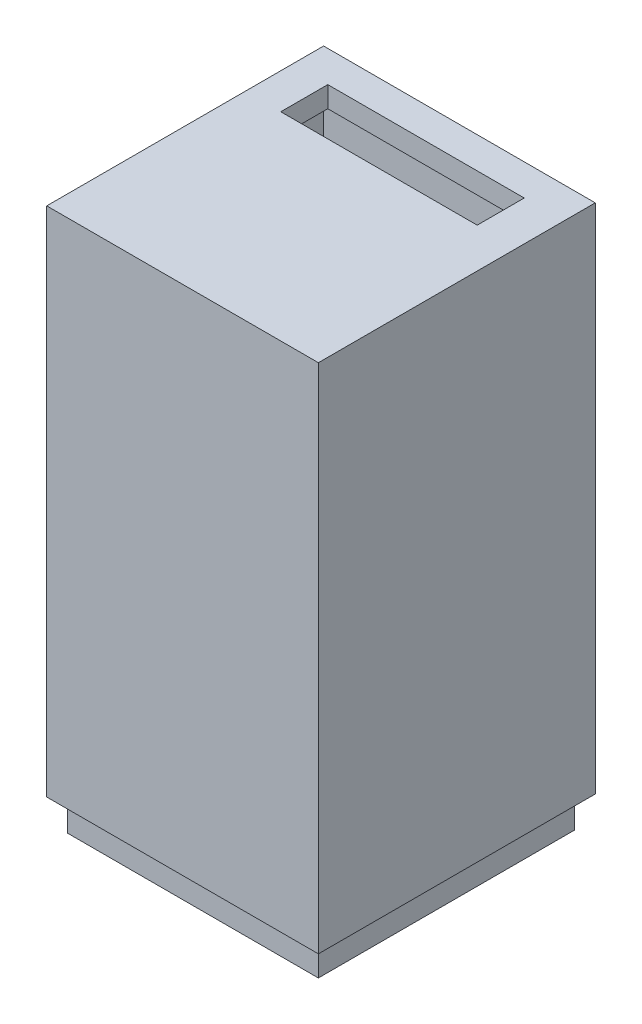
ISO-10303-21;
HEADER;
FILE_DESCRIPTION(('STEP AP214'),'2;1');
FILE_NAME('part.step','',(''),(''),'','','');
FILE_SCHEMA(('AUTOMOTIVE_DESIGN { 1 0 10303 214 1 1 1 1 }'));
ENDSEC;
DATA;
#1=APPLICATION_CONTEXT('core data for automotive mechanical design processes');
#2=APPLICATION_PROTOCOL_DEFINITION('international standard','automotive_design',2000,#1);
#3=PRODUCT_CONTEXT('',#1,'mechanical');
#4=PRODUCT('Part','Part','',(#3));
#5=PRODUCT_RELATED_PRODUCT_CATEGORY('part','',(#4));
#6=PRODUCT_DEFINITION_FORMATION('','',#4);
#7=PRODUCT_DEFINITION_CONTEXT('part definition',#1,'design');
#8=PRODUCT_DEFINITION('design','',#6,#7);
#9=PRODUCT_DEFINITION_SHAPE('','',#8);
#10=(LENGTH_UNIT() NAMED_UNIT(*) SI_UNIT(.MILLI.,.METRE.));
#11=(NAMED_UNIT(*) PLANE_ANGLE_UNIT() SI_UNIT($,.RADIAN.));
#12=(NAMED_UNIT(*) SI_UNIT($,.STERADIAN.) SOLID_ANGLE_UNIT());
#13=UNCERTAINTY_MEASURE_WITH_UNIT(LENGTH_MEASURE(1.E-05),#10,'distance_accuracy_value','');
#14=(GEOMETRIC_REPRESENTATION_CONTEXT(3) GLOBAL_UNCERTAINTY_ASSIGNED_CONTEXT((#13)) GLOBAL_UNIT_ASSIGNED_CONTEXT((#10,
#11,#12)) REPRESENTATION_CONTEXT('',''));
#15=CARTESIAN_POINT('',(0.,0.,0.));
#16=DIRECTION('',(0.,0.,1.));
#17=DIRECTION('',(1.,0.,0.));
#18=AXIS2_PLACEMENT_3D('',#15,#16,#17);
#19=CARTESIAN_POINT('',(0.,0.,0.));
#20=DIRECTION('',(0.,-1.,0.));
#21=DIRECTION('',(0.,0.,-1.));
#22=AXIS2_PLACEMENT_3D('',#19,#20,#21);
#23=PLANE('',#22);
#24=DIRECTION('',(0.,0.,-1.));
#25=VECTOR('',#24,1.);
#26=CARTESIAN_POINT('',(-2.,0.,19.));
#27=LINE('',#26,#25);
#28=CARTESIAN_POINT('',(-2.,0.,19.));
#29=VERTEX_POINT('',#28);
#30=CARTESIAN_POINT('',(-2.,0.,-7.5));
#31=VERTEX_POINT('',#30);
#32=EDGE_CURVE('E203',#29,#31,#27,.T.);
#33=ORIENTED_EDGE('',*,*,#32,.T.);
#34=DIRECTION('',(1.,0.,0.));
#35=VECTOR('',#34,1.);
#36=CARTESIAN_POINT('',(-2.,0.,-7.5));
#37=LINE('',#36,#35);
#38=CARTESIAN_POINT('',(24.,0.,-7.5));
#39=VERTEX_POINT('',#38);
#40=EDGE_CURVE('E205',#31,#39,#37,.T.);
#41=ORIENTED_EDGE('',*,*,#40,.T.);
#42=DIRECTION('',(0.,0.,1.));
#43=VECTOR('',#42,1.);
#44=CARTESIAN_POINT('',(24.,0.,19.));
#45=LINE('',#44,#43);
#46=CARTESIAN_POINT('',(24.,0.,19.));
#47=VERTEX_POINT('',#46);
#48=EDGE_CURVE('E56',#39,#47,#45,.T.);
#49=ORIENTED_EDGE('',*,*,#48,.T.);
#50=DIRECTION('',(-1.,0.,0.));
#51=VECTOR('',#50,1.);
#52=CARTESIAN_POINT('',(-2.,0.,19.));
#53=LINE('',#52,#51);
#54=EDGE_CURVE('E208',#47,#29,#53,.T.);
#55=ORIENTED_EDGE('',*,*,#54,.T.);
#56=EDGE_LOOP('',(#33,#41,#49,#55));
#57=FACE_BOUND('',#56,.T.);
#58=DIRECTION('',(1.,0.,0.));
#59=VECTOR('',#58,1.);
#60=CARTESIAN_POINT('',(-0.999999999999997,0.,-6.49906928932583));
#61=LINE('',#60,#59);
#62=CARTESIAN_POINT('',(-0.999999999999997,0.,-6.49906928932583));
#63=VERTEX_POINT('',#62);
#64=CARTESIAN_POINT('',(23.,0.,-6.49906928932583));
#65=VERTEX_POINT('',#64);
#66=EDGE_CURVE('E190',#63,#65,#61,.T.);
#67=ORIENTED_EDGE('',*,*,#66,.F.);
#68=DIRECTION('',(0.,0.,-1.));
#69=VECTOR('',#68,1.);
#70=CARTESIAN_POINT('',(-1.,0.,18.0009307106742));
#71=LINE('',#70,#69);
#72=CARTESIAN_POINT('',(-1.,0.,18.0009307106742));
#73=VERTEX_POINT('',#72);
#74=EDGE_CURVE('E176',#73,#63,#71,.T.);
#75=ORIENTED_EDGE('',*,*,#74,.F.);
#76=DIRECTION('',(-1.,0.,0.));
#77=VECTOR('',#76,1.);
#78=CARTESIAN_POINT('',(-1.,0.,18.0009307106742));
#79=LINE('',#78,#77);
#80=CARTESIAN_POINT('',(23.,0.,18.0009307106742));
#81=VERTEX_POINT('',#80);
#82=EDGE_CURVE('E181',#81,#73,#79,.T.);
#83=ORIENTED_EDGE('',*,*,#82,.F.);
#84=DIRECTION('',(0.,0.,1.));
#85=VECTOR('',#84,1.);
#86=CARTESIAN_POINT('',(23.,0.,18.0009307106742));
#87=LINE('',#86,#85);
#88=EDGE_CURVE('E192',#65,#81,#87,.T.);
#89=ORIENTED_EDGE('',*,*,#88,.F.);
#90=EDGE_LOOP('',(#67,#75,#83,#89));
#91=FACE_BOUND('',#90,.T.);
#92=ADVANCED_FACE('F33',(#57,#91),#23,.T.);
#93=CARTESIAN_POINT('',(-2.,49.,-5.5));
#94=DIRECTION('',(-1.,0.,0.));
#95=DIRECTION('',(0.,-1.,0.));
#96=AXIS2_PLACEMENT_3D('',#93,#94,#95);
#97=PLANE('',#96);
#98=DIRECTION('',(0.,1.,0.));
#99=VECTOR('',#98,1.);
#100=CARTESIAN_POINT('',(-1.99999999999999,49.,-7.5));
#101=LINE('',#100,#99);
#102=CARTESIAN_POINT('',(-1.99999999999999,49.,-7.5));
#103=VERTEX_POINT('',#102);
#104=EDGE_CURVE('E255',#31,#103,#101,.T.);
#105=ORIENTED_EDGE('',*,*,#104,.F.);
#106=ORIENTED_EDGE('',*,*,#32,.F.);
#107=DIRECTION('',(0.,-1.,0.));
#108=VECTOR('',#107,1.);
#109=CARTESIAN_POINT('',(-2.,49.,19.));
#110=LINE('',#109,#108);
#111=CARTESIAN_POINT('',(-2.,49.,19.));
#112=VERTEX_POINT('',#111);
#113=EDGE_CURVE('E210',#112,#29,#110,.T.);
#114=ORIENTED_EDGE('',*,*,#113,.F.);
#115=DIRECTION('',(0.,0.,1.));
#116=VECTOR('',#115,1.);
#117=CARTESIAN_POINT('',(-2.,49.,-5.5));
#118=LINE('',#117,#116);
#119=EDGE_CURVE('E11',#103,#112,#118,.T.);
#120=ORIENTED_EDGE('',*,*,#119,.F.);
#121=EDGE_LOOP('',(#105,#106,#114,#120));
#122=FACE_BOUND('',#121,.T.);
#123=ADVANCED_FACE('F35',(#122),#97,.T.);
#124=CARTESIAN_POINT('',(24.,49.,-5.5));
#125=DIRECTION('',(1.,0.,0.));
#126=DIRECTION('',(0.,1.,0.));
#127=AXIS2_PLACEMENT_3D('',#124,#125,#126);
#128=PLANE('',#127);
#129=DIRECTION('',(0.,1.,0.));
#130=VECTOR('',#129,1.);
#131=CARTESIAN_POINT('',(24.,49.,19.));
#132=LINE('',#131,#130);
#133=CARTESIAN_POINT('',(24.,49.,19.));
#134=VERTEX_POINT('',#133);
#135=EDGE_CURVE('E213',#47,#134,#132,.T.);
#136=ORIENTED_EDGE('',*,*,#135,.F.);
#137=ORIENTED_EDGE('',*,*,#48,.F.);
#138=DIRECTION('',(0.,-1.,0.));
#139=VECTOR('',#138,1.);
#140=CARTESIAN_POINT('',(24.,49.,-7.5));
#141=LINE('',#140,#139);
#142=CARTESIAN_POINT('',(24.,49.,-7.5));
#143=VERTEX_POINT('',#142);
#144=EDGE_CURVE('E252',#143,#39,#141,.T.);
#145=ORIENTED_EDGE('',*,*,#144,.F.);
#146=DIRECTION('',(0.,0.,1.));
#147=VECTOR('',#146,1.);
#148=CARTESIAN_POINT('',(24.,49.,-5.5));
#149=LINE('',#148,#147);
#150=EDGE_CURVE('E37',#143,#134,#149,.T.);
#151=ORIENTED_EDGE('',*,*,#150,.T.);
#152=EDGE_LOOP('',(#136,#137,#145,#151));
#153=FACE_BOUND('',#152,.T.);
#154=ADVANCED_FACE('F299',(#153),#128,.T.);
#155=CARTESIAN_POINT('',(0.,0.,-7.5));
#156=DIRECTION('',(0.,0.,-1.));
#157=DIRECTION('',(-1.,0.,0.));
#158=AXIS2_PLACEMENT_3D('',#155,#156,#157);
#159=PLANE('',#158);
#160=ORIENTED_EDGE('',*,*,#144,.T.);
#161=ORIENTED_EDGE('',*,*,#40,.F.);
#162=ORIENTED_EDGE('',*,*,#104,.T.);
#163=DIRECTION('',(1.,0.,0.));
#164=VECTOR('',#163,1.);
#165=CARTESIAN_POINT('',(24.,49.,-7.5));
#166=LINE('',#165,#164);
#167=EDGE_CURVE('E257',#103,#143,#166,.T.);
#168=ORIENTED_EDGE('',*,*,#167,.T.);
#169=EDGE_LOOP('',(#160,#161,#162,#168));
#170=FACE_BOUND('',#169,.T.);
#171=ADVANCED_FACE('F307',(#170),#159,.T.);
#172=CARTESIAN_POINT('',(0.,0.,19.));
#173=DIRECTION('',(0.,0.,1.));
#174=DIRECTION('',(1.,0.,0.));
#175=AXIS2_PLACEMENT_3D('',#172,#173,#174);
#176=PLANE('',#175);
#177=ORIENTED_EDGE('',*,*,#113,.T.);
#178=ORIENTED_EDGE('',*,*,#54,.F.);
#179=ORIENTED_EDGE('',*,*,#135,.T.);
#180=DIRECTION('',(-1.,0.,0.));
#181=VECTOR('',#180,1.);
#182=CARTESIAN_POINT('',(-2.,49.,19.));
#183=LINE('',#182,#181);
#184=EDGE_CURVE('E215',#134,#112,#183,.T.);
#185=ORIENTED_EDGE('',*,*,#184,.T.);
#186=EDGE_LOOP('',(#177,#178,#179,#185));
#187=FACE_BOUND('',#186,.T.);
#188=ADVANCED_FACE('F304',(#187),#176,.T.);
#189=CARTESIAN_POINT('',(-2.,49.,-5.5));
#190=DIRECTION('',(0.,1.,0.));
#191=DIRECTION('',(0.,0.,1.));
#192=AXIS2_PLACEMENT_3D('',#189,#190,#191);
#193=PLANE('',#192);
#194=DIRECTION('',(1.,0.,0.));
#195=VECTOR('',#194,1.);
#196=CARTESIAN_POINT('',(1.4,49.,-4.5));
#197=LINE('',#196,#195);
#198=CARTESIAN_POINT('',(1.4,49.,-4.5));
#199=VERTEX_POINT('',#198);
#200=CARTESIAN_POINT('',(20.2,49.,-4.5));
#201=VERTEX_POINT('',#200);
#202=EDGE_CURVE('E222',#199,#201,#197,.T.);
#203=ORIENTED_EDGE('',*,*,#202,.T.);
#204=DIRECTION('',(0.,0.,1.));
#205=VECTOR('',#204,1.);
#206=CARTESIAN_POINT('',(20.2,49.,-4.5));
#207=LINE('',#206,#205);
#208=CARTESIAN_POINT('',(20.2,49.,0.));
#209=VERTEX_POINT('',#208);
#210=EDGE_CURVE('E246',#201,#209,#207,.T.);
#211=ORIENTED_EDGE('',*,*,#210,.T.);
#212=DIRECTION('',(1.,0.,0.));
#213=VECTOR('',#212,1.);
#214=CARTESIAN_POINT('',(1.4,49.,0.));
#215=LINE('',#214,#213);
#216=CARTESIAN_POINT('',(1.4,49.,0.));
#217=VERTEX_POINT('',#216);
#218=EDGE_CURVE('E234',#217,#209,#215,.T.);
#219=ORIENTED_EDGE('',*,*,#218,.F.);
#220=DIRECTION('',(0.,0.,1.));
#221=VECTOR('',#220,1.);
#222=CARTESIAN_POINT('',(1.4,49.,-4.5));
#223=LINE('',#222,#221);
#224=EDGE_CURVE('E249',#199,#217,#223,.T.);
#225=ORIENTED_EDGE('',*,*,#224,.F.);
#226=EDGE_LOOP('',(#203,#211,#219,#225));
#227=FACE_BOUND('',#226,.T.);
#228=ORIENTED_EDGE('',*,*,#119,.T.);
#229=ORIENTED_EDGE('',*,*,#184,.F.);
#230=ORIENTED_EDGE('',*,*,#150,.F.);
#231=ORIENTED_EDGE('',*,*,#167,.F.);
#232=EDGE_LOOP('',(#228,#229,#230,#231));
#233=FACE_BOUND('',#232,.T.);
#234=ADVANCED_FACE('F306',(#227,#233),#193,.T.);
#235=CARTESIAN_POINT('',(0.,0.,-5.5));
#236=DIRECTION('',(-1.,0.,0.));
#237=DIRECTION('',(0.,0.,1.));
#238=AXIS2_PLACEMENT_3D('',#235,#236,#237);
#239=PLANE('',#238);
#240=DIRECTION('',(0.,0.,1.));
#241=VECTOR('',#240,1.);
#242=CARTESIAN_POINT('',(0.,47.,-5.5));
#243=LINE('',#242,#241);
#244=CARTESIAN_POINT('',(0.,47.,-5.5));
#245=VERTEX_POINT('',#244);
#246=CARTESIAN_POINT('',(0.,47.,17.));
#247=VERTEX_POINT('',#246);
#248=EDGE_CURVE('E269',#245,#247,#243,.T.);
#249=ORIENTED_EDGE('',*,*,#248,.T.);
#250=DIRECTION('',(0.,-1.,0.));
#251=VECTOR('',#250,1.);
#252=CARTESIAN_POINT('',(0.,0.,17.));
#253=LINE('',#252,#251);
#254=CARTESIAN_POINT('',(0.,-3.,17.));
#255=VERTEX_POINT('',#254);
#256=EDGE_CURVE('E163',#247,#255,#253,.T.);
#257=ORIENTED_EDGE('',*,*,#256,.T.);
#258=DIRECTION('',(0.,0.,-1.));
#259=VECTOR('',#258,1.);
#260=CARTESIAN_POINT('',(0.,-3.,17.));
#261=LINE('',#260,#259);
#262=CARTESIAN_POINT('',(0.,-3.,-5.5));
#263=VERTEX_POINT('',#262);
#264=EDGE_CURVE('E161',#255,#263,#261,.T.);
#265=ORIENTED_EDGE('',*,*,#264,.T.);
#266=DIRECTION('',(0.,-1.,0.));
#267=VECTOR('',#266,1.);
#268=CARTESIAN_POINT('',(0.,0.,-5.5));
#269=LINE('',#268,#267);
#270=EDGE_CURVE('E147',#245,#263,#269,.T.);
#271=ORIENTED_EDGE('',*,*,#270,.F.);
#272=EDGE_LOOP('',(#249,#257,#265,#271));
#273=FACE_BOUND('',#272,.T.);
#274=ADVANCED_FACE('F162',(#273),#239,.F.);
#275=CARTESIAN_POINT('',(0.,47.,-5.5));
#276=DIRECTION('',(0.,1.,0.));
#277=DIRECTION('',(0.,0.,1.));
#278=AXIS2_PLACEMENT_3D('',#275,#276,#277);
#279=PLANE('',#278);
#280=DIRECTION('',(0.,0.,1.));
#281=VECTOR('',#280,1.);
#282=CARTESIAN_POINT('',(20.2,47.,-4.5));
#283=LINE('',#282,#281);
#284=CARTESIAN_POINT('',(20.2,47.,-4.5));
#285=VERTEX_POINT('',#284);
#286=CARTESIAN_POINT('',(20.2,47.,0.));
#287=VERTEX_POINT('',#286);
#288=EDGE_CURVE('E243',#285,#287,#283,.T.);
#289=ORIENTED_EDGE('',*,*,#288,.F.);
#290=DIRECTION('',(1.,0.,0.));
#291=VECTOR('',#290,1.);
#292=CARTESIAN_POINT('',(1.4,47.,-4.5));
#293=LINE('',#292,#291);
#294=CARTESIAN_POINT('',(1.4,47.,-4.5));
#295=VERTEX_POINT('',#294);
#296=EDGE_CURVE('E229',#295,#285,#293,.T.);
#297=ORIENTED_EDGE('',*,*,#296,.F.);
#298=DIRECTION('',(0.,0.,1.));
#299=VECTOR('',#298,1.);
#300=CARTESIAN_POINT('',(1.4,47.,-4.5));
#301=LINE('',#300,#299);
#302=CARTESIAN_POINT('',(1.4,47.,0.));
#303=VERTEX_POINT('',#302);
#304=EDGE_CURVE('E232',#295,#303,#301,.T.);
#305=ORIENTED_EDGE('',*,*,#304,.T.);
#306=DIRECTION('',(1.,0.,0.));
#307=VECTOR('',#306,1.);
#308=CARTESIAN_POINT('',(1.4,47.,0.));
#309=LINE('',#308,#307);
#310=EDGE_CURVE('E223',#303,#287,#309,.T.);
#311=ORIENTED_EDGE('',*,*,#310,.T.);
#312=EDGE_LOOP('',(#289,#297,#305,#311));
#313=FACE_BOUND('',#312,.T.);
#314=DIRECTION('',(0.,0.,1.));
#315=VECTOR('',#314,1.);
#316=CARTESIAN_POINT('',(22.,47.,-5.5));
#317=LINE('',#316,#315);
#318=CARTESIAN_POINT('',(22.,47.,-5.5));
#319=VERTEX_POINT('',#318);
#320=CARTESIAN_POINT('',(22.,47.,17.));
#321=VERTEX_POINT('',#320);
#322=EDGE_CURVE('E268',#319,#321,#317,.T.);
#323=ORIENTED_EDGE('',*,*,#322,.T.);
#324=DIRECTION('',(-1.,0.,0.));
#325=VECTOR('',#324,1.);
#326=CARTESIAN_POINT('',(0.,47.,17.));
#327=LINE('',#326,#325);
#328=EDGE_CURVE('E158',#321,#247,#327,.T.);
#329=ORIENTED_EDGE('',*,*,#328,.T.);
#330=ORIENTED_EDGE('',*,*,#248,.F.);
#331=DIRECTION('',(-1.,0.,0.));
#332=VECTOR('',#331,1.);
#333=CARTESIAN_POINT('',(0.,47.,-5.5));
#334=LINE('',#333,#332);
#335=EDGE_CURVE('E154',#319,#245,#334,.T.);
#336=ORIENTED_EDGE('',*,*,#335,.F.);
#337=EDGE_LOOP('',(#323,#329,#330,#336));
#338=FACE_BOUND('',#337,.T.);
#339=ADVANCED_FACE('F274',(#313,#338),#279,.F.);
#340=CARTESIAN_POINT('',(22.,0.,-5.5));
#341=DIRECTION('',(1.,0.,0.));
#342=DIRECTION('',(0.,1.,0.));
#343=AXIS2_PLACEMENT_3D('',#340,#341,#342);
#344=PLANE('',#343);
#345=DIRECTION('',(0.,1.,0.));
#346=VECTOR('',#345,1.);
#347=CARTESIAN_POINT('',(22.,0.,-5.5));
#348=LINE('',#347,#346);
#349=CARTESIAN_POINT('',(22.,-3.,-5.5));
#350=VERTEX_POINT('',#349);
#351=EDGE_CURVE('E157',#350,#319,#348,.T.);
#352=ORIENTED_EDGE('',*,*,#351,.F.);
#353=DIRECTION('',(0.,0.,1.));
#354=VECTOR('',#353,1.);
#355=CARTESIAN_POINT('',(22.,-3.,17.));
#356=LINE('',#355,#354);
#357=CARTESIAN_POINT('',(22.,-3.,17.));
#358=VERTEX_POINT('',#357);
#359=EDGE_CURVE('E170',#350,#358,#356,.T.);
#360=ORIENTED_EDGE('',*,*,#359,.T.);
#361=DIRECTION('',(0.,1.,0.));
#362=VECTOR('',#361,1.);
#363=CARTESIAN_POINT('',(22.,0.,17.));
#364=LINE('',#363,#362);
#365=EDGE_CURVE('E261',#358,#321,#364,.T.);
#366=ORIENTED_EDGE('',*,*,#365,.T.);
#367=ORIENTED_EDGE('',*,*,#322,.F.);
#368=EDGE_LOOP('',(#352,#360,#366,#367));
#369=FACE_BOUND('',#368,.T.);
#370=ADVANCED_FACE('F276',(#369),#344,.F.);
#371=CARTESIAN_POINT('',(0.,0.,-5.5));
#372=DIRECTION('',(0.,0.,-1.));
#373=DIRECTION('',(-1.,0.,0.));
#374=AXIS2_PLACEMENT_3D('',#371,#372,#373);
#375=PLANE('',#374);
#376=ORIENTED_EDGE('',*,*,#351,.T.);
#377=ORIENTED_EDGE('',*,*,#335,.T.);
#378=ORIENTED_EDGE('',*,*,#270,.T.);
#379=DIRECTION('',(1.,0.,0.));
#380=VECTOR('',#379,1.);
#381=CARTESIAN_POINT('',(0.,-3.,-5.5));
#382=LINE('',#381,#380);
#383=EDGE_CURVE('E152',#263,#350,#382,.T.);
#384=ORIENTED_EDGE('',*,*,#383,.T.);
#385=EDGE_LOOP('',(#376,#377,#378,#384));
#386=FACE_BOUND('',#385,.T.);
#387=ADVANCED_FACE('F150',(#386),#375,.F.);
#388=CARTESIAN_POINT('',(1.4,47.,-4.5));
#389=DIRECTION('',(1.,0.,0.));
#390=DIRECTION('',(0.,1.,0.));
#391=AXIS2_PLACEMENT_3D('',#388,#389,#390);
#392=PLANE('',#391);
#393=DIRECTION('',(0.,1.,0.));
#394=VECTOR('',#393,1.);
#395=CARTESIAN_POINT('',(1.4,47.,0.));
#396=LINE('',#395,#394);
#397=EDGE_CURVE('E218',#303,#217,#396,.T.);
#398=ORIENTED_EDGE('',*,*,#397,.F.);
#399=ORIENTED_EDGE('',*,*,#304,.F.);
#400=DIRECTION('',(0.,1.,0.));
#401=VECTOR('',#400,1.);
#402=CARTESIAN_POINT('',(1.4,47.,-4.5));
#403=LINE('',#402,#401);
#404=EDGE_CURVE('E219',#295,#199,#403,.T.);
#405=ORIENTED_EDGE('',*,*,#404,.T.);
#406=ORIENTED_EDGE('',*,*,#224,.T.);
#407=EDGE_LOOP('',(#398,#399,#405,#406));
#408=FACE_BOUND('',#407,.T.);
#409=ADVANCED_FACE('F341',(#408),#392,.T.);
#410=CARTESIAN_POINT('',(20.2,47.,-4.5));
#411=DIRECTION('',(1.,0.,0.));
#412=DIRECTION('',(0.,0.,-1.));
#413=AXIS2_PLACEMENT_3D('',#410,#411,#412);
#414=PLANE('',#413);
#415=DIRECTION('',(0.,1.,0.));
#416=VECTOR('',#415,1.);
#417=CARTESIAN_POINT('',(20.2,47.,0.));
#418=LINE('',#417,#416);
#419=EDGE_CURVE('E236',#287,#209,#418,.T.);
#420=ORIENTED_EDGE('',*,*,#419,.T.);
#421=ORIENTED_EDGE('',*,*,#210,.F.);
#422=DIRECTION('',(0.,1.,0.));
#423=VECTOR('',#422,1.);
#424=CARTESIAN_POINT('',(20.2,47.,-4.5));
#425=LINE('',#424,#423);
#426=EDGE_CURVE('E226',#285,#201,#425,.T.);
#427=ORIENTED_EDGE('',*,*,#426,.F.);
#428=ORIENTED_EDGE('',*,*,#288,.T.);
#429=EDGE_LOOP('',(#420,#421,#427,#428));
#430=FACE_BOUND('',#429,.T.);
#431=ADVANCED_FACE('F345',(#430),#414,.F.);
#432=CARTESIAN_POINT('',(0.,0.,-4.5));
#433=DIRECTION('',(0.,0.,-1.));
#434=DIRECTION('',(-1.,0.,0.));
#435=AXIS2_PLACEMENT_3D('',#432,#433,#434);
#436=PLANE('',#435);
#437=ORIENTED_EDGE('',*,*,#404,.F.);
#438=ORIENTED_EDGE('',*,*,#296,.T.);
#439=ORIENTED_EDGE('',*,*,#426,.T.);
#440=ORIENTED_EDGE('',*,*,#202,.F.);
#441=EDGE_LOOP('',(#437,#438,#439,#440));
#442=FACE_BOUND('',#441,.T.);
#443=ADVANCED_FACE('F289',(#442),#436,.F.);
#444=CARTESIAN_POINT('',(0.,0.,0.));
#445=DIRECTION('',(0.,0.,-1.));
#446=DIRECTION('',(-1.,0.,0.));
#447=AXIS2_PLACEMENT_3D('',#444,#445,#446);
#448=PLANE('',#447);
#449=ORIENTED_EDGE('',*,*,#397,.T.);
#450=ORIENTED_EDGE('',*,*,#218,.T.);
#451=ORIENTED_EDGE('',*,*,#419,.F.);
#452=ORIENTED_EDGE('',*,*,#310,.F.);
#453=EDGE_LOOP('',(#449,#450,#451,#452));
#454=FACE_BOUND('',#453,.T.);
#455=ADVANCED_FACE('F280',(#454),#448,.T.);
#456=CARTESIAN_POINT('',(0.,0.,17.));
#457=DIRECTION('',(0.,0.,1.));
#458=DIRECTION('',(1.,0.,0.));
#459=AXIS2_PLACEMENT_3D('',#456,#457,#458);
#460=PLANE('',#459);
#461=ORIENTED_EDGE('',*,*,#365,.F.);
#462=DIRECTION('',(-1.,0.,0.));
#463=VECTOR('',#462,1.);
#464=CARTESIAN_POINT('',(0.,-3.,17.));
#465=LINE('',#464,#463);
#466=EDGE_CURVE('E172',#358,#255,#465,.T.);
#467=ORIENTED_EDGE('',*,*,#466,.T.);
#468=ORIENTED_EDGE('',*,*,#256,.F.);
#469=ORIENTED_EDGE('',*,*,#328,.F.);
#470=EDGE_LOOP('',(#461,#467,#468,#469));
#471=FACE_BOUND('',#470,.T.);
#472=ADVANCED_FACE('F278',(#471),#460,.F.);
#473=CARTESIAN_POINT('',(0.,-3.,0.));
#474=DIRECTION('',(0.,-1.,0.));
#475=DIRECTION('',(0.,0.,-1.));
#476=AXIS2_PLACEMENT_3D('',#473,#474,#475);
#477=PLANE('',#476);
#478=DIRECTION('',(0.,0.,-1.));
#479=VECTOR('',#478,1.);
#480=CARTESIAN_POINT('',(-1.,-3.,18.0009307106742));
#481=LINE('',#480,#479);
#482=CARTESIAN_POINT('',(-1.,-3.,18.0009307106742));
#483=VERTEX_POINT('',#482);
#484=CARTESIAN_POINT('',(-0.999999999999997,-3.,-6.49906928932583));
#485=VERTEX_POINT('',#484);
#486=EDGE_CURVE('E177',#483,#485,#481,.T.);
#487=ORIENTED_EDGE('',*,*,#486,.T.);
#488=DIRECTION('',(1.,0.,0.));
#489=VECTOR('',#488,1.);
#490=CARTESIAN_POINT('',(-0.999999999999997,-3.,-6.49906928932583));
#491=LINE('',#490,#489);
#492=CARTESIAN_POINT('',(23.,-3.,-6.49906928932583));
#493=VERTEX_POINT('',#492);
#494=EDGE_CURVE('E180',#485,#493,#491,.T.);
#495=ORIENTED_EDGE('',*,*,#494,.T.);
#496=DIRECTION('',(0.,0.,1.));
#497=VECTOR('',#496,1.);
#498=CARTESIAN_POINT('',(23.,-3.,18.0009307106742));
#499=LINE('',#498,#497);
#500=CARTESIAN_POINT('',(23.,-3.,18.0009307106742));
#501=VERTEX_POINT('',#500);
#502=EDGE_CURVE('E183',#493,#501,#499,.T.);
#503=ORIENTED_EDGE('',*,*,#502,.T.);
#504=DIRECTION('',(-1.,0.,0.));
#505=VECTOR('',#504,1.);
#506=CARTESIAN_POINT('',(-1.,-3.,18.0009307106742));
#507=LINE('',#506,#505);
#508=EDGE_CURVE('E185',#501,#483,#507,.T.);
#509=ORIENTED_EDGE('',*,*,#508,.T.);
#510=EDGE_LOOP('',(#487,#495,#503,#509));
#511=FACE_BOUND('',#510,.T.);
#512=ORIENTED_EDGE('',*,*,#383,.F.);
#513=ORIENTED_EDGE('',*,*,#264,.F.);
#514=ORIENTED_EDGE('',*,*,#466,.F.);
#515=ORIENTED_EDGE('',*,*,#359,.F.);
#516=EDGE_LOOP('',(#512,#513,#514,#515));
#517=FACE_BOUND('',#516,.T.);
#518=ADVANCED_FACE('F168',(#511,#517),#477,.T.);
#519=CARTESIAN_POINT('',(-1.,-3.,18.0009307106742));
#520=DIRECTION('',(1.,0.,0.));
#521=DIRECTION('',(0.,0.,-1.));
#522=AXIS2_PLACEMENT_3D('',#519,#520,#521);
#523=PLANE('',#522);
#524=ORIENTED_EDGE('',*,*,#74,.T.);
#525=DIRECTION('',(0.,1.,0.));
#526=VECTOR('',#525,1.);
#527=CARTESIAN_POINT('',(-0.999999999999997,-3.,-6.49906928932583));
#528=LINE('',#527,#526);
#529=EDGE_CURVE('E201',#485,#63,#528,.T.);
#530=ORIENTED_EDGE('',*,*,#529,.F.);
#531=ORIENTED_EDGE('',*,*,#486,.F.);
#532=DIRECTION('',(0.,1.,0.));
#533=VECTOR('',#532,1.);
#534=CARTESIAN_POINT('',(-1.,-3.,18.0009307106742));
#535=LINE('',#534,#533);
#536=EDGE_CURVE('E187',#483,#73,#535,.T.);
#537=ORIENTED_EDGE('',*,*,#536,.T.);
#538=EDGE_LOOP('',(#524,#530,#531,#537));
#539=FACE_BOUND('',#538,.T.);
#540=ADVANCED_FACE('F286',(#539),#523,.F.);
#541=CARTESIAN_POINT('',(-0.999999999999997,-3.,-6.49906928932583));
#542=DIRECTION('',(0.,0.,1.));
#543=DIRECTION('',(1.,0.,0.));
#544=AXIS2_PLACEMENT_3D('',#541,#542,#543);
#545=PLANE('',#544);
#546=ORIENTED_EDGE('',*,*,#66,.T.);
#547=DIRECTION('',(0.,1.,0.));
#548=VECTOR('',#547,1.);
#549=CARTESIAN_POINT('',(23.,-3.,-6.49906928932583));
#550=LINE('',#549,#548);
#551=EDGE_CURVE('E198',#493,#65,#550,.T.);
#552=ORIENTED_EDGE('',*,*,#551,.F.);
#553=ORIENTED_EDGE('',*,*,#494,.F.);
#554=ORIENTED_EDGE('',*,*,#529,.T.);
#555=EDGE_LOOP('',(#546,#552,#553,#554));
#556=FACE_BOUND('',#555,.T.);
#557=ADVANCED_FACE('F447',(#556),#545,.F.);
#558=CARTESIAN_POINT('',(23.,-3.,18.0009307106742));
#559=DIRECTION('',(-1.,0.,0.));
#560=DIRECTION('',(0.,0.,1.));
#561=AXIS2_PLACEMENT_3D('',#558,#559,#560);
#562=PLANE('',#561);
#563=ORIENTED_EDGE('',*,*,#88,.T.);
#564=DIRECTION('',(0.,1.,0.));
#565=VECTOR('',#564,1.);
#566=CARTESIAN_POINT('',(23.,-3.,18.0009307106742));
#567=LINE('',#566,#565);
#568=EDGE_CURVE('E48',#501,#81,#567,.T.);
#569=ORIENTED_EDGE('',*,*,#568,.F.);
#570=ORIENTED_EDGE('',*,*,#502,.F.);
#571=ORIENTED_EDGE('',*,*,#551,.T.);
#572=EDGE_LOOP('',(#563,#569,#570,#571));
#573=FACE_BOUND('',#572,.T.);
#574=ADVANCED_FACE('F456',(#573),#562,.F.);
#575=CARTESIAN_POINT('',(-1.,-3.,18.0009307106742));
#576=DIRECTION('',(0.,0.,-1.));
#577=DIRECTION('',(-1.,0.,0.));
#578=AXIS2_PLACEMENT_3D('',#575,#576,#577);
#579=PLANE('',#578);
#580=ORIENTED_EDGE('',*,*,#82,.T.);
#581=ORIENTED_EDGE('',*,*,#536,.F.);
#582=ORIENTED_EDGE('',*,*,#508,.F.);
#583=ORIENTED_EDGE('',*,*,#568,.T.);
#584=EDGE_LOOP('',(#580,#581,#582,#583));
#585=FACE_BOUND('',#584,.T.);
#586=ADVANCED_FACE('F465',(#585),#579,.F.);
#587=CLOSED_SHELL('',(#92,#123,#154,#171,#188,#234,#274,#339,#370,#387,#409,#431,#443,#455,#472,
#518,#540,#557,#574,#586));
#588=MANIFOLD_SOLID_BREP('B2',#587);
#589=ADVANCED_BREP_SHAPE_REPRESENTATION('',(#18,#588),#14);
#590=SHAPE_DEFINITION_REPRESENTATION(#9,#589);
ENDSEC;
END-ISO-10303-21;
